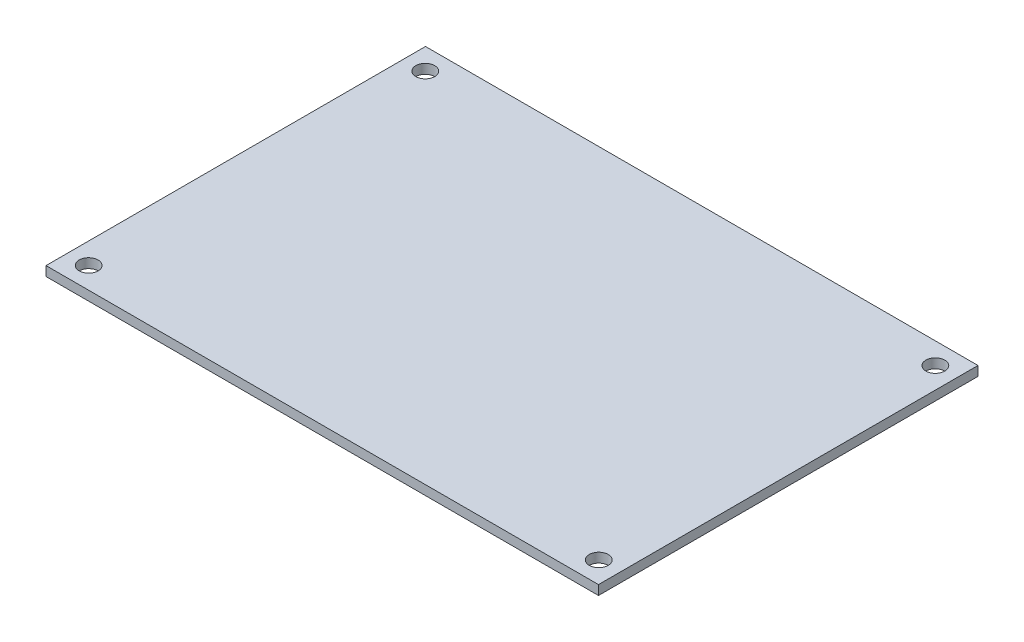
ISO-10303-21;
HEADER;
FILE_DESCRIPTION(('STEP AP214'),'2;1');
FILE_NAME('part.step','',(''),(''),'','','');
FILE_SCHEMA(('AUTOMOTIVE_DESIGN { 1 0 10303 214 1 1 1 1 }'));
ENDSEC;
DATA;
#1=APPLICATION_CONTEXT('core data for automotive mechanical design processes');
#2=APPLICATION_PROTOCOL_DEFINITION('international standard','automotive_design',2000,#1);
#3=PRODUCT_CONTEXT('',#1,'mechanical');
#4=PRODUCT('Part','Part','',(#3));
#5=PRODUCT_RELATED_PRODUCT_CATEGORY('part','',(#4));
#6=PRODUCT_DEFINITION_FORMATION('','',#4);
#7=PRODUCT_DEFINITION_CONTEXT('part definition',#1,'design');
#8=PRODUCT_DEFINITION('design','',#6,#7);
#9=PRODUCT_DEFINITION_SHAPE('','',#8);
#10=(LENGTH_UNIT() NAMED_UNIT(*) SI_UNIT(.MILLI.,.METRE.));
#11=(NAMED_UNIT(*) PLANE_ANGLE_UNIT() SI_UNIT($,.RADIAN.));
#12=(NAMED_UNIT(*) SI_UNIT($,.STERADIAN.) SOLID_ANGLE_UNIT());
#13=UNCERTAINTY_MEASURE_WITH_UNIT(LENGTH_MEASURE(1.E-05),#10,'distance_accuracy_value','');
#14=(GEOMETRIC_REPRESENTATION_CONTEXT(3) GLOBAL_UNCERTAINTY_ASSIGNED_CONTEXT((#13)) GLOBAL_UNIT_ASSIGNED_CONTEXT((#10,
#11,#12)) REPRESENTATION_CONTEXT('',''));
#15=CARTESIAN_POINT('',(0.,0.,0.));
#16=DIRECTION('',(0.,0.,1.));
#17=DIRECTION('',(1.,0.,0.));
#18=AXIS2_PLACEMENT_3D('',#15,#16,#17);
#19=CARTESIAN_POINT('',(43.675,1.5,-30.));
#20=DIRECTION('',(-1.,0.,0.));
#21=DIRECTION('',(0.,0.,1.));
#22=AXIS2_PLACEMENT_3D('',#19,#20,#21);
#23=PLANE('',#22);
#24=DIRECTION('',(0.,0.,-1.));
#25=VECTOR('',#24,1.);
#26=CARTESIAN_POINT('',(43.675,0.,-30.));
#27=LINE('',#26,#25);
#28=CARTESIAN_POINT('',(43.675,0.,30.));
#29=VERTEX_POINT('',#28);
#30=CARTESIAN_POINT('',(43.675,0.,-30.));
#31=VERTEX_POINT('',#30);
#32=EDGE_CURVE('E102',#29,#31,#27,.T.);
#33=ORIENTED_EDGE('',*,*,#32,.T.);
#34=DIRECTION('',(0.,-1.,0.));
#35=VECTOR('',#34,1.);
#36=CARTESIAN_POINT('',(43.675,1.5,-30.));
#37=LINE('',#36,#35);
#38=CARTESIAN_POINT('',(43.675,1.5,-30.));
#39=VERTEX_POINT('',#38);
#40=EDGE_CURVE('E11',#39,#31,#37,.T.);
#41=ORIENTED_EDGE('',*,*,#40,.F.);
#42=DIRECTION('',(0.,0.,-1.));
#43=VECTOR('',#42,1.);
#44=CARTESIAN_POINT('',(43.675,1.5,-30.));
#45=LINE('',#44,#43);
#46=CARTESIAN_POINT('',(43.675,1.5,30.));
#47=VERTEX_POINT('',#46);
#48=EDGE_CURVE('E90',#47,#39,#45,.T.);
#49=ORIENTED_EDGE('',*,*,#48,.F.);
#50=DIRECTION('',(0.,-1.,0.));
#51=VECTOR('',#50,1.);
#52=CARTESIAN_POINT('',(43.675,1.5,30.));
#53=LINE('',#52,#51);
#54=EDGE_CURVE('E98',#47,#29,#53,.T.);
#55=ORIENTED_EDGE('',*,*,#54,.T.);
#56=EDGE_LOOP('',(#33,#41,#49,#55));
#57=FACE_BOUND('',#56,.T.);
#58=ADVANCED_FACE('F39',(#57),#23,.F.);
#59=CARTESIAN_POINT('',(-43.675,1.5,-30.));
#60=DIRECTION('',(0.,0.,1.));
#61=DIRECTION('',(1.,0.,0.));
#62=AXIS2_PLACEMENT_3D('',#59,#60,#61);
#63=PLANE('',#62);
#64=DIRECTION('',(-1.,0.,0.));
#65=VECTOR('',#64,1.);
#66=CARTESIAN_POINT('',(-43.675,0.,-30.));
#67=LINE('',#66,#65);
#68=CARTESIAN_POINT('',(-43.675,0.,-30.));
#69=VERTEX_POINT('',#68);
#70=EDGE_CURVE('E94',#31,#69,#67,.T.);
#71=ORIENTED_EDGE('',*,*,#70,.T.);
#72=DIRECTION('',(0.,-1.,0.));
#73=VECTOR('',#72,1.);
#74=CARTESIAN_POINT('',(-43.675,1.5,-30.));
#75=LINE('',#74,#73);
#76=CARTESIAN_POINT('',(-43.675,1.5,-30.));
#77=VERTEX_POINT('',#76);
#78=EDGE_CURVE('E47',#77,#69,#75,.T.);
#79=ORIENTED_EDGE('',*,*,#78,.F.);
#80=DIRECTION('',(-1.,0.,0.));
#81=VECTOR('',#80,1.);
#82=CARTESIAN_POINT('',(-43.675,1.5,-30.));
#83=LINE('',#82,#81);
#84=EDGE_CURVE('E85',#39,#77,#83,.T.);
#85=ORIENTED_EDGE('',*,*,#84,.F.);
#86=ORIENTED_EDGE('',*,*,#40,.T.);
#87=EDGE_LOOP('',(#71,#79,#85,#86));
#88=FACE_BOUND('',#87,.T.);
#89=ADVANCED_FACE('F93',(#88),#63,.F.);
#90=CARTESIAN_POINT('',(-43.675,1.5,-30.));
#91=DIRECTION('',(1.,0.,0.));
#92=DIRECTION('',(0.,0.,-1.));
#93=AXIS2_PLACEMENT_3D('',#90,#91,#92);
#94=PLANE('',#93);
#95=DIRECTION('',(0.,0.,1.));
#96=VECTOR('',#95,1.);
#97=CARTESIAN_POINT('',(-43.675,0.,-30.));
#98=LINE('',#97,#96);
#99=CARTESIAN_POINT('',(-43.675,0.,30.));
#100=VERTEX_POINT('',#99);
#101=EDGE_CURVE('E72',#69,#100,#98,.T.);
#102=ORIENTED_EDGE('',*,*,#101,.T.);
#103=DIRECTION('',(0.,-1.,0.));
#104=VECTOR('',#103,1.);
#105=CARTESIAN_POINT('',(-43.675,1.5,30.));
#106=LINE('',#105,#104);
#107=CARTESIAN_POINT('',(-43.675,1.5,30.));
#108=VERTEX_POINT('',#107);
#109=EDGE_CURVE('E95',#108,#100,#106,.T.);
#110=ORIENTED_EDGE('',*,*,#109,.F.);
#111=DIRECTION('',(0.,0.,1.));
#112=VECTOR('',#111,1.);
#113=CARTESIAN_POINT('',(-43.675,1.5,-30.));
#114=LINE('',#113,#112);
#115=EDGE_CURVE('E88',#77,#108,#114,.T.);
#116=ORIENTED_EDGE('',*,*,#115,.F.);
#117=ORIENTED_EDGE('',*,*,#78,.T.);
#118=EDGE_LOOP('',(#102,#110,#116,#117));
#119=FACE_BOUND('',#118,.T.);
#120=ADVANCED_FACE('F96',(#119),#94,.F.);
#121=CARTESIAN_POINT('',(-43.675,1.5,30.));
#122=DIRECTION('',(0.,0.,-1.));
#123=DIRECTION('',(-1.,0.,0.));
#124=AXIS2_PLACEMENT_3D('',#121,#122,#123);
#125=PLANE('',#124);
#126=DIRECTION('',(1.,0.,0.));
#127=VECTOR('',#126,1.);
#128=CARTESIAN_POINT('',(-43.675,0.,30.));
#129=LINE('',#128,#127);
#130=EDGE_CURVE('E78',#100,#29,#129,.T.);
#131=ORIENTED_EDGE('',*,*,#130,.T.);
#132=ORIENTED_EDGE('',*,*,#54,.F.);
#133=DIRECTION('',(1.,0.,0.));
#134=VECTOR('',#133,1.);
#135=CARTESIAN_POINT('',(-43.675,1.5,30.));
#136=LINE('',#135,#134);
#137=EDGE_CURVE('E55',#108,#47,#136,.T.);
#138=ORIENTED_EDGE('',*,*,#137,.F.);
#139=ORIENTED_EDGE('',*,*,#109,.T.);
#140=EDGE_LOOP('',(#131,#132,#138,#139));
#141=FACE_BOUND('',#140,.T.);
#142=ADVANCED_FACE('F110',(#141),#125,.F.);
#143=CARTESIAN_POINT('',(0.,1.5,0.));
#144=DIRECTION('',(0.,1.,0.));
#145=DIRECTION('',(0.,0.,1.));
#146=AXIS2_PLACEMENT_3D('',#143,#144,#145);
#147=PLANE('',#146);
#148=CARTESIAN_POINT('',(-40.3225,1.5,26.608));
#149=DIRECTION('',(0.,1.,0.));
#150=DIRECTION('',(0.,0.,1.));
#151=AXIS2_PLACEMENT_3D('',#148,#149,#150);
#152=CIRCLE('',#151,1.5);
#153=CARTESIAN_POINT('',(-40.3225,1.5,28.108));
#154=VERTEX_POINT('',#153);
#155=EDGE_CURVE('E125',#154,#154,#152,.T.);
#156=ORIENTED_EDGE('',*,*,#155,.F.);
#157=EDGE_LOOP('',(#156));
#158=FACE_BOUND('',#157,.T.);
#159=CARTESIAN_POINT('',(40.3225,1.5,26.608));
#160=DIRECTION('',(0.,1.,0.));
#161=DIRECTION('',(0.,0.,1.));
#162=AXIS2_PLACEMENT_3D('',#159,#160,#161);
#163=CIRCLE('',#162,1.5);
#164=CARTESIAN_POINT('',(40.3225,1.5,28.108));
#165=VERTEX_POINT('',#164);
#166=EDGE_CURVE('E131',#165,#165,#163,.T.);
#167=ORIENTED_EDGE('',*,*,#166,.F.);
#168=EDGE_LOOP('',(#167));
#169=FACE_BOUND('',#168,.T.);
#170=CARTESIAN_POINT('',(40.3225,1.5,-26.608));
#171=DIRECTION('',(0.,1.,0.));
#172=DIRECTION('',(0.,0.,1.));
#173=AXIS2_PLACEMENT_3D('',#170,#171,#172);
#174=CIRCLE('',#173,1.5);
#175=CARTESIAN_POINT('',(40.3225,1.5,-25.108));
#176=VERTEX_POINT('',#175);
#177=EDGE_CURVE('E119',#176,#176,#174,.T.);
#178=ORIENTED_EDGE('',*,*,#177,.F.);
#179=EDGE_LOOP('',(#178));
#180=FACE_BOUND('',#179,.T.);
#181=CARTESIAN_POINT('',(-40.3225,1.5,-26.608));
#182=DIRECTION('',(0.,1.,0.));
#183=DIRECTION('',(0.,0.,1.));
#184=AXIS2_PLACEMENT_3D('',#181,#182,#183);
#185=CIRCLE('',#184,1.5);
#186=CARTESIAN_POINT('',(-40.3225,1.5,-25.108));
#187=VERTEX_POINT('',#186);
#188=EDGE_CURVE('E116',#187,#187,#185,.T.);
#189=ORIENTED_EDGE('',*,*,#188,.F.);
#190=EDGE_LOOP('',(#189));
#191=FACE_BOUND('',#190,.T.);
#192=ORIENTED_EDGE('',*,*,#48,.T.);
#193=ORIENTED_EDGE('',*,*,#84,.T.);
#194=ORIENTED_EDGE('',*,*,#115,.T.);
#195=ORIENTED_EDGE('',*,*,#137,.T.);
#196=EDGE_LOOP('',(#192,#193,#194,#195));
#197=FACE_BOUND('',#196,.T.);
#198=ADVANCED_FACE('F86',(#158,#169,#180,#191,#197),#147,.T.);
#199=CARTESIAN_POINT('',(0.,0.,0.));
#200=DIRECTION('',(0.,1.,0.));
#201=DIRECTION('',(0.,0.,1.));
#202=AXIS2_PLACEMENT_3D('',#199,#200,#201);
#203=PLANE('',#202);
#204=CARTESIAN_POINT('',(-40.3225,0.,26.608));
#205=DIRECTION('',(0.,1.,0.));
#206=DIRECTION('',(0.,0.,1.));
#207=AXIS2_PLACEMENT_3D('',#204,#205,#206);
#208=CIRCLE('',#207,1.5);
#209=CARTESIAN_POINT('',(-40.3225,0.,28.108));
#210=VERTEX_POINT('',#209);
#211=EDGE_CURVE('E122',#210,#210,#208,.T.);
#212=ORIENTED_EDGE('',*,*,#211,.T.);
#213=EDGE_LOOP('',(#212));
#214=FACE_BOUND('',#213,.T.);
#215=CARTESIAN_POINT('',(40.3225,0.,26.608));
#216=DIRECTION('',(0.,1.,0.));
#217=DIRECTION('',(0.,0.,1.));
#218=AXIS2_PLACEMENT_3D('',#215,#216,#217);
#219=CIRCLE('',#218,1.5);
#220=CARTESIAN_POINT('',(40.3225,0.,28.108));
#221=VERTEX_POINT('',#220);
#222=EDGE_CURVE('E128',#221,#221,#219,.T.);
#223=ORIENTED_EDGE('',*,*,#222,.T.);
#224=EDGE_LOOP('',(#223));
#225=FACE_BOUND('',#224,.T.);
#226=CARTESIAN_POINT('',(40.3225,0.,-26.608));
#227=DIRECTION('',(0.,1.,0.));
#228=DIRECTION('',(0.,0.,1.));
#229=AXIS2_PLACEMENT_3D('',#226,#227,#228);
#230=CIRCLE('',#229,1.5);
#231=CARTESIAN_POINT('',(40.3225,0.,-25.108));
#232=VERTEX_POINT('',#231);
#233=EDGE_CURVE('E134',#232,#232,#230,.T.);
#234=ORIENTED_EDGE('',*,*,#233,.T.);
#235=EDGE_LOOP('',(#234));
#236=FACE_BOUND('',#235,.T.);
#237=CARTESIAN_POINT('',(-40.3225,0.,-26.608));
#238=DIRECTION('',(0.,1.,0.));
#239=DIRECTION('',(0.,0.,1.));
#240=AXIS2_PLACEMENT_3D('',#237,#238,#239);
#241=CIRCLE('',#240,1.5);
#242=CARTESIAN_POINT('',(-40.3225,0.,-25.108));
#243=VERTEX_POINT('',#242);
#244=EDGE_CURVE('E105',#243,#243,#241,.T.);
#245=ORIENTED_EDGE('',*,*,#244,.T.);
#246=EDGE_LOOP('',(#245));
#247=FACE_BOUND('',#246,.T.);
#248=ORIENTED_EDGE('',*,*,#32,.F.);
#249=ORIENTED_EDGE('',*,*,#130,.F.);
#250=ORIENTED_EDGE('',*,*,#101,.F.);
#251=ORIENTED_EDGE('',*,*,#70,.F.);
#252=EDGE_LOOP('',(#248,#249,#250,#251));
#253=FACE_BOUND('',#252,.T.);
#254=ADVANCED_FACE('F113',(#214,#225,#236,#247,#253),#203,.F.);
#255=CARTESIAN_POINT('',(-40.3225,0.,-26.608));
#256=DIRECTION('',(0.,1.,0.));
#257=DIRECTION('',(0.,0.,1.));
#258=AXIS2_PLACEMENT_3D('',#255,#256,#257);
#259=CYLINDRICAL_SURFACE('',#258,1.5);
#260=ORIENTED_EDGE('',*,*,#244,.F.);
#261=EDGE_LOOP('',(#260));
#262=FACE_BOUND('',#261,.T.);
#263=ORIENTED_EDGE('',*,*,#188,.T.);
#264=EDGE_LOOP('',(#263));
#265=FACE_BOUND('',#264,.T.);
#266=ADVANCED_FACE('F148',(#262,#265),#259,.F.);
#267=CARTESIAN_POINT('',(40.3225,0.,-26.608));
#268=DIRECTION('',(0.,1.,0.));
#269=DIRECTION('',(0.,0.,1.));
#270=AXIS2_PLACEMENT_3D('',#267,#268,#269);
#271=CYLINDRICAL_SURFACE('',#270,1.5);
#272=ORIENTED_EDGE('',*,*,#233,.F.);
#273=EDGE_LOOP('',(#272));
#274=FACE_BOUND('',#273,.T.);
#275=ORIENTED_EDGE('',*,*,#177,.T.);
#276=EDGE_LOOP('',(#275));
#277=FACE_BOUND('',#276,.T.);
#278=ADVANCED_FACE('F140',(#274,#277),#271,.F.);
#279=CARTESIAN_POINT('',(40.3225,0.,26.608));
#280=DIRECTION('',(0.,1.,0.));
#281=DIRECTION('',(0.,0.,1.));
#282=AXIS2_PLACEMENT_3D('',#279,#280,#281);
#283=CYLINDRICAL_SURFACE('',#282,1.5);
#284=ORIENTED_EDGE('',*,*,#222,.F.);
#285=EDGE_LOOP('',(#284));
#286=FACE_BOUND('',#285,.T.);
#287=ORIENTED_EDGE('',*,*,#166,.T.);
#288=EDGE_LOOP('',(#287));
#289=FACE_BOUND('',#288,.T.);
#290=ADVANCED_FACE('F156',(#286,#289),#283,.F.);
#291=CARTESIAN_POINT('',(-40.3225,0.,26.608));
#292=DIRECTION('',(0.,1.,0.));
#293=DIRECTION('',(0.,0.,1.));
#294=AXIS2_PLACEMENT_3D('',#291,#292,#293);
#295=CYLINDRICAL_SURFACE('',#294,1.5);
#296=ORIENTED_EDGE('',*,*,#211,.F.);
#297=EDGE_LOOP('',(#296));
#298=FACE_BOUND('',#297,.T.);
#299=ORIENTED_EDGE('',*,*,#155,.T.);
#300=EDGE_LOOP('',(#299));
#301=FACE_BOUND('',#300,.T.);
#302=ADVANCED_FACE('F207',(#298,#301),#295,.F.);
#303=CLOSED_SHELL('',(#58,#89,#120,#142,#198,#254,#266,#278,#290,#302));
#304=MANIFOLD_SOLID_BREP('B2',#303);
#305=ADVANCED_BREP_SHAPE_REPRESENTATION('',(#18,#304),#14);
#306=SHAPE_DEFINITION_REPRESENTATION(#9,#305);
ENDSEC;
END-ISO-10303-21;
